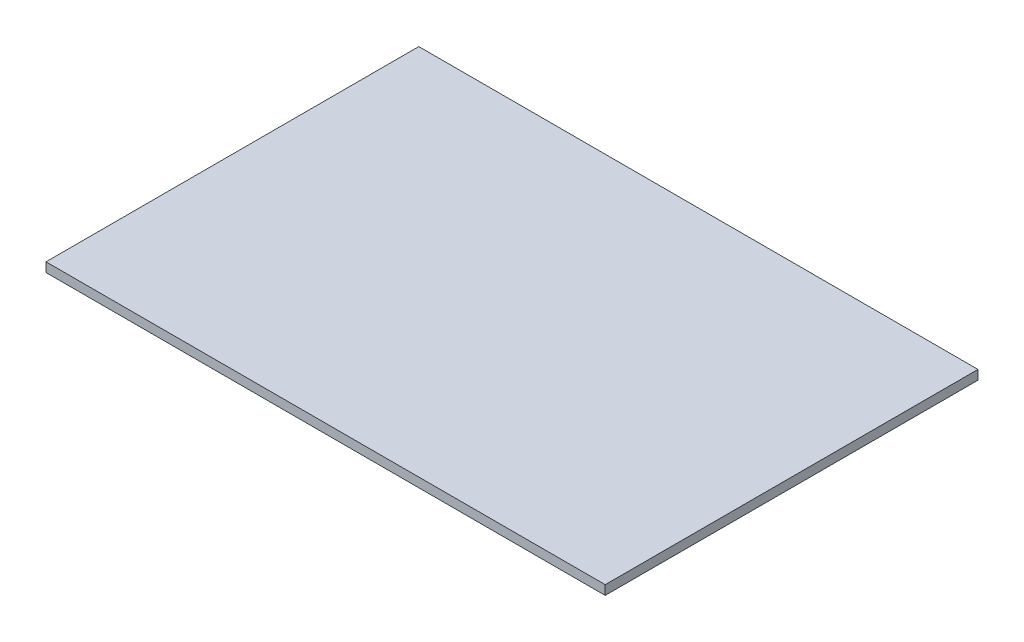
ISO-10303-21;
HEADER;
FILE_DESCRIPTION(('STEP AP214'),'2;1');
FILE_NAME('part.step','',(''),(''),'','','');
FILE_SCHEMA(('AUTOMOTIVE_DESIGN { 1 0 10303 214 1 1 1 1 }'));
ENDSEC;
DATA;
#1=APPLICATION_CONTEXT('core data for automotive mechanical design processes');
#2=APPLICATION_PROTOCOL_DEFINITION('international standard','automotive_design',2000,#1);
#3=PRODUCT_CONTEXT('',#1,'mechanical');
#4=PRODUCT('Part','Part','',(#3));
#5=PRODUCT_RELATED_PRODUCT_CATEGORY('part','',(#4));
#6=PRODUCT_DEFINITION_FORMATION('','',#4);
#7=PRODUCT_DEFINITION_CONTEXT('part definition',#1,'design');
#8=PRODUCT_DEFINITION('design','',#6,#7);
#9=PRODUCT_DEFINITION_SHAPE('','',#8);
#10=(LENGTH_UNIT() NAMED_UNIT(*) SI_UNIT(.MILLI.,.METRE.));
#11=(NAMED_UNIT(*) PLANE_ANGLE_UNIT() SI_UNIT($,.RADIAN.));
#12=(NAMED_UNIT(*) SI_UNIT($,.STERADIAN.) SOLID_ANGLE_UNIT());
#13=UNCERTAINTY_MEASURE_WITH_UNIT(LENGTH_MEASURE(1.E-05),#10,'distance_accuracy_value','');
#14=(GEOMETRIC_REPRESENTATION_CONTEXT(3) GLOBAL_UNCERTAINTY_ASSIGNED_CONTEXT((#13)) GLOBAL_UNIT_ASSIGNED_CONTEXT((#10,
#11,#12)) REPRESENTATION_CONTEXT('',''));
#15=CARTESIAN_POINT('',(0.,0.,0.));
#16=DIRECTION('',(0.,0.,1.));
#17=DIRECTION('',(1.,0.,0.));
#18=AXIS2_PLACEMENT_3D('',#15,#16,#17);
#19=CARTESIAN_POINT('',(190.5,6.35,-127.));
#20=DIRECTION('',(-1.,0.,0.));
#21=DIRECTION('',(0.,0.,1.));
#22=AXIS2_PLACEMENT_3D('',#19,#20,#21);
#23=PLANE('',#22);
#24=DIRECTION('',(0.,0.,-1.));
#25=VECTOR('',#24,1.);
#26=CARTESIAN_POINT('',(190.5,0.,-127.));
#27=LINE('',#26,#25);
#28=CARTESIAN_POINT('',(190.5,0.,127.));
#29=VERTEX_POINT('',#28);
#30=CARTESIAN_POINT('',(190.5,0.,-127.));
#31=VERTEX_POINT('',#30);
#32=EDGE_CURVE('E98',#29,#31,#27,.T.);
#33=ORIENTED_EDGE('',*,*,#32,.T.);
#34=DIRECTION('',(0.,-1.,0.));
#35=VECTOR('',#34,1.);
#36=CARTESIAN_POINT('',(190.5,6.35,-127.));
#37=LINE('',#36,#35);
#38=CARTESIAN_POINT('',(190.5,6.35,-127.));
#39=VERTEX_POINT('',#38);
#40=EDGE_CURVE('E11',#39,#31,#37,.T.);
#41=ORIENTED_EDGE('',*,*,#40,.F.);
#42=DIRECTION('',(0.,0.,-1.));
#43=VECTOR('',#42,1.);
#44=CARTESIAN_POINT('',(190.5,6.35,-127.));
#45=LINE('',#44,#43);
#46=CARTESIAN_POINT('',(190.5,6.35,127.));
#47=VERTEX_POINT('',#46);
#48=EDGE_CURVE('E86',#47,#39,#45,.T.);
#49=ORIENTED_EDGE('',*,*,#48,.F.);
#50=DIRECTION('',(0.,-1.,0.));
#51=VECTOR('',#50,1.);
#52=CARTESIAN_POINT('',(190.5,6.35,127.));
#53=LINE('',#52,#51);
#54=EDGE_CURVE('E94',#47,#29,#53,.T.);
#55=ORIENTED_EDGE('',*,*,#54,.T.);
#56=EDGE_LOOP('',(#33,#41,#49,#55));
#57=FACE_BOUND('',#56,.T.);
#58=ADVANCED_FACE('F35',(#57),#23,.F.);
#59=CARTESIAN_POINT('',(-190.5,6.35,-127.));
#60=DIRECTION('',(0.,0.,1.));
#61=DIRECTION('',(1.,0.,0.));
#62=AXIS2_PLACEMENT_3D('',#59,#60,#61);
#63=PLANE('',#62);
#64=DIRECTION('',(-1.,0.,0.));
#65=VECTOR('',#64,1.);
#66=CARTESIAN_POINT('',(-190.5,0.,-127.));
#67=LINE('',#66,#65);
#68=CARTESIAN_POINT('',(-190.5,0.,-127.));
#69=VERTEX_POINT('',#68);
#70=EDGE_CURVE('E90',#31,#69,#67,.T.);
#71=ORIENTED_EDGE('',*,*,#70,.T.);
#72=DIRECTION('',(0.,-1.,0.));
#73=VECTOR('',#72,1.);
#74=CARTESIAN_POINT('',(-190.5,6.35,-127.));
#75=LINE('',#74,#73);
#76=CARTESIAN_POINT('',(-190.5,6.35,-127.));
#77=VERTEX_POINT('',#76);
#78=EDGE_CURVE('E43',#77,#69,#75,.T.);
#79=ORIENTED_EDGE('',*,*,#78,.F.);
#80=DIRECTION('',(-1.,0.,0.));
#81=VECTOR('',#80,1.);
#82=CARTESIAN_POINT('',(-190.5,6.35,-127.));
#83=LINE('',#82,#81);
#84=EDGE_CURVE('E81',#39,#77,#83,.T.);
#85=ORIENTED_EDGE('',*,*,#84,.F.);
#86=ORIENTED_EDGE('',*,*,#40,.T.);
#87=EDGE_LOOP('',(#71,#79,#85,#86));
#88=FACE_BOUND('',#87,.T.);
#89=ADVANCED_FACE('F89',(#88),#63,.F.);
#90=CARTESIAN_POINT('',(-190.5,6.35,-127.));
#91=DIRECTION('',(1.,0.,0.));
#92=DIRECTION('',(0.,0.,-1.));
#93=AXIS2_PLACEMENT_3D('',#90,#91,#92);
#94=PLANE('',#93);
#95=DIRECTION('',(0.,0.,1.));
#96=VECTOR('',#95,1.);
#97=CARTESIAN_POINT('',(-190.5,0.,-127.));
#98=LINE('',#97,#96);
#99=CARTESIAN_POINT('',(-190.5,0.,127.));
#100=VERTEX_POINT('',#99);
#101=EDGE_CURVE('E68',#69,#100,#98,.T.);
#102=ORIENTED_EDGE('',*,*,#101,.T.);
#103=DIRECTION('',(0.,-1.,0.));
#104=VECTOR('',#103,1.);
#105=CARTESIAN_POINT('',(-190.5,6.35,127.));
#106=LINE('',#105,#104);
#107=CARTESIAN_POINT('',(-190.5,6.35,127.));
#108=VERTEX_POINT('',#107);
#109=EDGE_CURVE('E91',#108,#100,#106,.T.);
#110=ORIENTED_EDGE('',*,*,#109,.F.);
#111=DIRECTION('',(0.,0.,1.));
#112=VECTOR('',#111,1.);
#113=CARTESIAN_POINT('',(-190.5,6.35,-127.));
#114=LINE('',#113,#112);
#115=EDGE_CURVE('E84',#77,#108,#114,.T.);
#116=ORIENTED_EDGE('',*,*,#115,.F.);
#117=ORIENTED_EDGE('',*,*,#78,.T.);
#118=EDGE_LOOP('',(#102,#110,#116,#117));
#119=FACE_BOUND('',#118,.T.);
#120=ADVANCED_FACE('F92',(#119),#94,.F.);
#121=CARTESIAN_POINT('',(-190.5,6.35,127.));
#122=DIRECTION('',(0.,0.,-1.));
#123=DIRECTION('',(-1.,0.,0.));
#124=AXIS2_PLACEMENT_3D('',#121,#122,#123);
#125=PLANE('',#124);
#126=DIRECTION('',(1.,0.,0.));
#127=VECTOR('',#126,1.);
#128=CARTESIAN_POINT('',(-190.5,0.,127.));
#129=LINE('',#128,#127);
#130=EDGE_CURVE('E74',#100,#29,#129,.T.);
#131=ORIENTED_EDGE('',*,*,#130,.T.);
#132=ORIENTED_EDGE('',*,*,#54,.F.);
#133=DIRECTION('',(1.,0.,0.));
#134=VECTOR('',#133,1.);
#135=CARTESIAN_POINT('',(-190.5,6.35,127.));
#136=LINE('',#135,#134);
#137=EDGE_CURVE('E51',#108,#47,#136,.T.);
#138=ORIENTED_EDGE('',*,*,#137,.F.);
#139=ORIENTED_EDGE('',*,*,#109,.T.);
#140=EDGE_LOOP('',(#131,#132,#138,#139));
#141=FACE_BOUND('',#140,.T.);
#142=ADVANCED_FACE('F105',(#141),#125,.F.);
#143=CARTESIAN_POINT('',(0.,6.35,0.));
#144=DIRECTION('',(0.,1.,0.));
#145=DIRECTION('',(0.,0.,1.));
#146=AXIS2_PLACEMENT_3D('',#143,#144,#145);
#147=PLANE('',#146);
#148=ORIENTED_EDGE('',*,*,#48,.T.);
#149=ORIENTED_EDGE('',*,*,#84,.T.);
#150=ORIENTED_EDGE('',*,*,#115,.T.);
#151=ORIENTED_EDGE('',*,*,#137,.T.);
#152=EDGE_LOOP('',(#148,#149,#150,#151));
#153=FACE_BOUND('',#152,.T.);
#154=ADVANCED_FACE('F82',(#153),#147,.T.);
#155=CARTESIAN_POINT('',(0.,0.,0.));
#156=DIRECTION('',(0.,1.,0.));
#157=DIRECTION('',(0.,0.,1.));
#158=AXIS2_PLACEMENT_3D('',#155,#156,#157);
#159=PLANE('',#158);
#160=ORIENTED_EDGE('',*,*,#32,.F.);
#161=ORIENTED_EDGE('',*,*,#130,.F.);
#162=ORIENTED_EDGE('',*,*,#101,.F.);
#163=ORIENTED_EDGE('',*,*,#70,.F.);
#164=EDGE_LOOP('',(#160,#161,#162,#163));
#165=FACE_BOUND('',#164,.T.);
#166=ADVANCED_FACE('F108',(#165),#159,.F.);
#167=CLOSED_SHELL('',(#58,#89,#120,#142,#154,#166));
#168=MANIFOLD_SOLID_BREP('B2',#167);
#169=ADVANCED_BREP_SHAPE_REPRESENTATION('',(#18,#168),#14);
#170=SHAPE_DEFINITION_REPRESENTATION(#9,#169);
ENDSEC;
END-ISO-10303-21;
